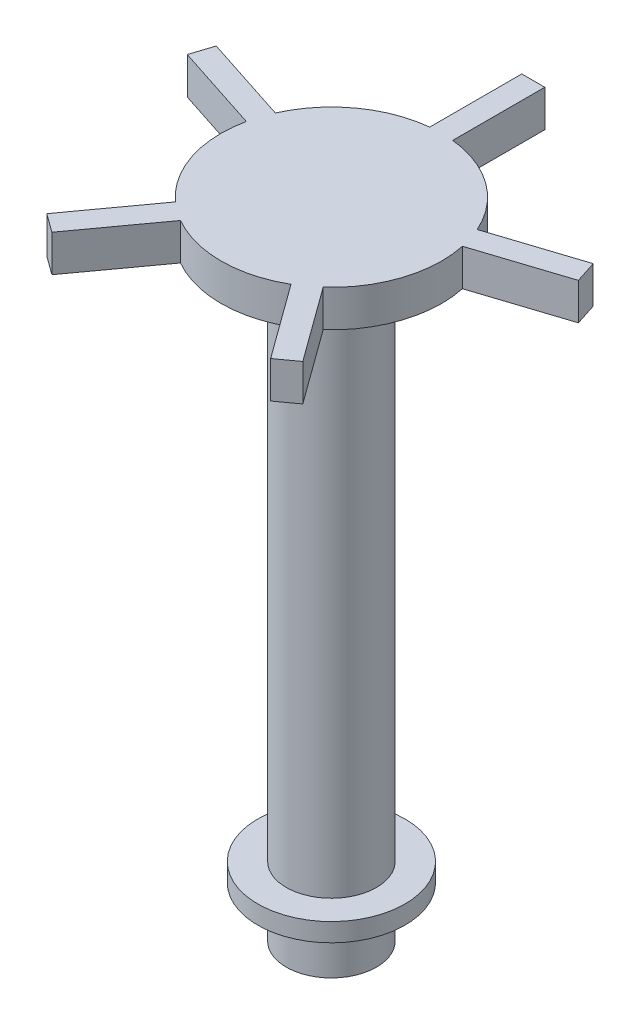
ISO-10303-21;
HEADER;
FILE_DESCRIPTION(('STEP AP214'),'2;1');
FILE_NAME('part.step','',(''),(''),'','','');
FILE_SCHEMA(('AUTOMOTIVE_DESIGN { 1 0 10303 214 1 1 1 1 }'));
ENDSEC;
DATA;
#1=APPLICATION_CONTEXT('core data for automotive mechanical design processes');
#2=APPLICATION_PROTOCOL_DEFINITION('international standard','automotive_design',2000,#1);
#3=PRODUCT_CONTEXT('',#1,'mechanical');
#4=PRODUCT('Part','Part','',(#3));
#5=PRODUCT_RELATED_PRODUCT_CATEGORY('part','',(#4));
#6=PRODUCT_DEFINITION_FORMATION('','',#4);
#7=PRODUCT_DEFINITION_CONTEXT('part definition',#1,'design');
#8=PRODUCT_DEFINITION('design','',#6,#7);
#9=PRODUCT_DEFINITION_SHAPE('','',#8);
#10=(LENGTH_UNIT() NAMED_UNIT(*) SI_UNIT(.MILLI.,.METRE.));
#11=(NAMED_UNIT(*) PLANE_ANGLE_UNIT() SI_UNIT($,.RADIAN.));
#12=(NAMED_UNIT(*) SI_UNIT($,.STERADIAN.) SOLID_ANGLE_UNIT());
#13=UNCERTAINTY_MEASURE_WITH_UNIT(LENGTH_MEASURE(1.E-05),#10,'distance_accuracy_value','');
#14=(GEOMETRIC_REPRESENTATION_CONTEXT(3) GLOBAL_UNCERTAINTY_ASSIGNED_CONTEXT((#13)) GLOBAL_UNIT_ASSIGNED_CONTEXT((#10,
#11,#12)) REPRESENTATION_CONTEXT('',''));
#15=CARTESIAN_POINT('',(0.,0.,0.));
#16=DIRECTION('',(0.,0.,1.));
#17=DIRECTION('',(1.,0.,0.));
#18=AXIS2_PLACEMENT_3D('',#15,#16,#17);
#19=CARTESIAN_POINT('',(0.,-35.,0.));
#20=DIRECTION('',(0.,-1.,0.));
#21=DIRECTION('',(0.,0.,-1.));
#22=AXIS2_PLACEMENT_3D('',#19,#20,#21);
#23=CYLINDRICAL_SURFACE('',#22,12.);
#24=CARTESIAN_POINT('',(0.,35.,0.));
#25=DIRECTION('',(0.,-1.,0.));
#26=DIRECTION('',(0.,0.,-1.));
#27=AXIS2_PLACEMENT_3D('',#24,#25,#26);
#28=CIRCLE('',#27,12.);
#29=CARTESIAN_POINT('',(-8.02632262780261,35.,8.92065833189591));
#30=VERTEX_POINT('',#29);
#31=CARTESIAN_POINT('',(-11.7368628164568,35.,-2.49921012075276));
#32=VERTEX_POINT('',#31);
#33=EDGE_CURVE('E201',#30,#32,#28,.T.);
#34=ORIENTED_EDGE('',*,*,#33,.T.);
#35=DIRECTION('',(0.,1.,0.));
#36=VECTOR('',#35,1.);
#37=CARTESIAN_POINT('',(-11.7368628164568,19.3535729678745,-2.49921012075276));
#38=LINE('',#37,#36);
#39=CARTESIAN_POINT('',(-11.7368628164568,31.,-2.49921012075276));
#40=VERTEX_POINT('',#39);
#41=EDGE_CURVE('E335',#40,#32,#38,.T.);
#42=ORIENTED_EDGE('',*,*,#41,.F.);
#43=CARTESIAN_POINT('',(0.,31.,0.));
#44=DIRECTION('',(0.,-1.,0.));
#45=DIRECTION('',(0.,0.,-1.));
#46=AXIS2_PLACEMENT_3D('',#43,#44,#45);
#47=CIRCLE('',#46,12.);
#48=CARTESIAN_POINT('',(-8.02632262780261,31.,8.92065833189591));
#49=VERTEX_POINT('',#48);
#50=EDGE_CURVE('E213',#49,#40,#47,.T.);
#51=ORIENTED_EDGE('',*,*,#50,.F.);
#52=DIRECTION('',(0.,1.,0.));
#53=VECTOR('',#52,1.);
#54=CARTESIAN_POINT('',(-8.02632262780261,18.598273272856,8.92065833189591));
#55=LINE('',#54,#53);
#56=EDGE_CURVE('E64',#49,#30,#55,.T.);
#57=ORIENTED_EDGE('',*,*,#56,.T.);
#58=EDGE_LOOP('',(#34,#42,#51,#57));
#59=FACE_BOUND('',#58,.T.);
#60=ADVANCED_FACE('F40',(#59),#23,.T.);
#61=CARTESIAN_POINT('',(6.00378014186511,35.,10.3901214626272));
#62=VERTEX_POINT('',#61);
#63=CARTESIAN_POINT('',(-6.00378014186525,35.,10.3901214626271));
#64=VERTEX_POINT('',#63);
#65=EDGE_CURVE('E204',#62,#64,#28,.T.);
#66=ORIENTED_EDGE('',*,*,#65,.T.);
#67=DIRECTION('',(0.,1.,0.));
#68=VECTOR('',#67,1.);
#69=CARTESIAN_POINT('',(-6.00378014186525,18.598273272856,10.3901214626271));
#70=LINE('',#69,#68);
#71=CARTESIAN_POINT('',(-6.00378014186525,31.,10.3901214626271));
#72=VERTEX_POINT('',#71);
#73=EDGE_CURVE('E316',#72,#64,#70,.T.);
#74=ORIENTED_EDGE('',*,*,#73,.F.);
#75=CARTESIAN_POINT('',(6.0037801418651,31.,10.3901214626272));
#76=VERTEX_POINT('',#75);
#77=EDGE_CURVE('E211',#76,#72,#47,.T.);
#78=ORIENTED_EDGE('',*,*,#77,.F.);
#79=DIRECTION('',(0.,1.,0.));
#80=VECTOR('',#79,1.);
#81=CARTESIAN_POINT('',(6.00378014186511,18.598273272856,10.3901214626272));
#82=LINE('',#81,#80);
#83=EDGE_CURVE('E286',#76,#62,#82,.T.);
#84=ORIENTED_EDGE('',*,*,#83,.T.);
#85=EDGE_LOOP('',(#66,#74,#78,#84));
#86=FACE_BOUND('',#85,.T.);
#87=ADVANCED_FACE('F370',(#86),#23,.T.);
#88=CARTESIAN_POINT('',(11.7368628164569,35.,-2.49921012075259));
#89=VERTEX_POINT('',#88);
#90=CARTESIAN_POINT('',(8.02632262780248,35.,8.92065833189603));
#91=VERTEX_POINT('',#90);
#92=EDGE_CURVE('E48',#89,#91,#28,.T.);
#93=ORIENTED_EDGE('',*,*,#92,.T.);
#94=DIRECTION('',(0.,1.,0.));
#95=VECTOR('',#94,1.);
#96=CARTESIAN_POINT('',(8.02632262780248,18.598273272856,8.92065833189603));
#97=LINE('',#96,#95);
#98=CARTESIAN_POINT('',(8.02632262780248,31.,8.92065833189603));
#99=VERTEX_POINT('',#98);
#100=EDGE_CURVE('E294',#99,#91,#97,.T.);
#101=ORIENTED_EDGE('',*,*,#100,.F.);
#102=CARTESIAN_POINT('',(11.7368628164569,31.,-2.49921012075259));
#103=VERTEX_POINT('',#102);
#104=EDGE_CURVE('E206',#103,#99,#47,.T.);
#105=ORIENTED_EDGE('',*,*,#104,.F.);
#106=DIRECTION('',(0.,1.,0.));
#107=VECTOR('',#106,1.);
#108=CARTESIAN_POINT('',(11.7368628164569,19.3535729678745,-2.49921012075259));
#109=LINE('',#108,#107);
#110=EDGE_CURVE('E261',#103,#89,#109,.T.);
#111=ORIENTED_EDGE('',*,*,#110,.T.);
#112=EDGE_LOOP('',(#93,#101,#105,#111));
#113=FACE_BOUND('',#112,.T.);
#114=ADVANCED_FACE('F381',(#113),#23,.T.);
#115=CARTESIAN_POINT('',(1.25,35.,-11.93471826228));
#116=VERTEX_POINT('',#115);
#117=CARTESIAN_POINT('',(10.9643203305195,35.,-4.87685141149048));
#118=VERTEX_POINT('',#117);
#119=EDGE_CURVE('E11',#116,#118,#28,.T.);
#120=ORIENTED_EDGE('',*,*,#119,.T.);
#121=DIRECTION('',(0.,1.,0.));
#122=VECTOR('',#121,1.);
#123=CARTESIAN_POINT('',(10.9643203305195,19.3535729678745,-4.87685141149048));
#124=LINE('',#123,#122);
#125=CARTESIAN_POINT('',(10.9643203305195,31.,-4.87685141149048));
#126=VERTEX_POINT('',#125);
#127=EDGE_CURVE('E269',#126,#118,#124,.T.);
#128=ORIENTED_EDGE('',*,*,#127,.F.);
#129=CARTESIAN_POINT('',(1.25,31.,-11.93471826228));
#130=VERTEX_POINT('',#129);
#131=EDGE_CURVE('E202',#130,#126,#47,.T.);
#132=ORIENTED_EDGE('',*,*,#131,.F.);
#133=DIRECTION('',(0.,1.,0.));
#134=VECTOR('',#133,1.);
#135=CARTESIAN_POINT('',(1.25,20.6922359359558,-11.93471826228));
#136=LINE('',#135,#134);
#137=EDGE_CURVE('E239',#130,#116,#136,.T.);
#138=ORIENTED_EDGE('',*,*,#137,.T.);
#139=EDGE_LOOP('',(#120,#128,#132,#138));
#140=FACE_BOUND('',#139,.T.);
#141=ADVANCED_FACE('F404',(#140),#23,.T.);
#142=CARTESIAN_POINT('',(0.,35.,0.));
#143=DIRECTION('',(0.,-1.,0.));
#144=DIRECTION('',(0.,0.,-1.));
#145=AXIS2_PLACEMENT_3D('',#142,#143,#144);
#146=PLANE('',#145);
#147=ORIENTED_EDGE('',*,*,#119,.F.);
#148=DIRECTION('',(0.,0.,-1.));
#149=VECTOR('',#148,1.);
#150=CARTESIAN_POINT('',(1.25,35.,-11.93471826228));
#151=LINE('',#150,#149);
#152=CARTESIAN_POINT('',(1.25,35.,-21.93471826228));
#153=VERTEX_POINT('',#152);
#154=EDGE_CURVE('E252',#116,#153,#151,.T.);
#155=ORIENTED_EDGE('',*,*,#154,.T.);
#156=DIRECTION('',(-1.,0.,0.));
#157=VECTOR('',#156,1.);
#158=CARTESIAN_POINT('',(-1.25,35.,-21.93471826228));
#159=LINE('',#158,#157);
#160=CARTESIAN_POINT('',(-1.25,35.,-21.93471826228));
#161=VERTEX_POINT('',#160);
#162=EDGE_CURVE('E250',#153,#161,#159,.T.);
#163=ORIENTED_EDGE('',*,*,#162,.T.);
#164=DIRECTION('',(0.,0.,1.));
#165=VECTOR('',#164,1.);
#166=CARTESIAN_POINT('',(-1.25,35.,-11.93471826228));
#167=LINE('',#166,#165);
#168=CARTESIAN_POINT('',(-1.25,35.,-11.93471826228));
#169=VERTEX_POINT('',#168);
#170=EDGE_CURVE('E200',#161,#169,#167,.T.);
#171=ORIENTED_EDGE('',*,*,#170,.T.);
#172=CARTESIAN_POINT('',(-10.9643203305194,35.,-4.87685141149063));
#173=VERTEX_POINT('',#172);
#174=EDGE_CURVE('E49',#173,#169,#28,.T.);
#175=ORIENTED_EDGE('',*,*,#174,.F.);
#176=DIRECTION('',(-0.95105651629515,0.,-0.309016994374958));
#177=VECTOR('',#176,1.);
#178=CARTESIAN_POINT('',(-10.9643203305194,35.,-4.87685141149063));
#179=LINE('',#178,#177);
#180=CARTESIAN_POINT('',(-20.4748854934709,35.,-7.96702135524021));
#181=VERTEX_POINT('',#180);
#182=EDGE_CURVE('E178',#173,#181,#179,.T.);
#183=ORIENTED_EDGE('',*,*,#182,.T.);
#184=DIRECTION('',(-0.309016994374958,0.,0.95105651629515));
#185=VECTOR('',#184,1.);
#186=CARTESIAN_POINT('',(-21.2474279794083,35.,-5.58938006450234));
#187=LINE('',#186,#185);
#188=CARTESIAN_POINT('',(-21.2474279794083,35.,-5.58938006450234));
#189=VERTEX_POINT('',#188);
#190=EDGE_CURVE('E186',#181,#189,#187,.T.);
#191=ORIENTED_EDGE('',*,*,#190,.T.);
#192=DIRECTION('',(0.95105651629515,0.,0.309016994374958));
#193=VECTOR('',#192,1.);
#194=CARTESIAN_POINT('',(-11.7368628164568,35.,-2.49921012075276));
#195=LINE('',#194,#193);
#196=EDGE_CURVE('E194',#189,#32,#195,.T.);
#197=ORIENTED_EDGE('',*,*,#196,.T.);
#198=ORIENTED_EDGE('',*,*,#33,.F.);
#199=DIRECTION('',(-0.58778525229248,0.,0.809016994374942));
#200=VECTOR('',#199,1.);
#201=CARTESIAN_POINT('',(-8.02632262780261,35.,8.92065833189591));
#202=LINE('',#201,#200);
#203=CARTESIAN_POINT('',(-13.9041751507274,35.,17.0108282756453));
#204=VERTEX_POINT('',#203);
#205=EDGE_CURVE('E324',#30,#204,#202,.T.);
#206=ORIENTED_EDGE('',*,*,#205,.T.);
#207=DIRECTION('',(0.809016994374942,0.,0.58778525229248));
#208=VECTOR('',#207,1.);
#209=CARTESIAN_POINT('',(-11.8816326647901,35.,18.4802914063765));
#210=LINE('',#209,#208);
#211=CARTESIAN_POINT('',(-11.8816326647901,35.,18.4802914063765));
#212=VERTEX_POINT('',#211);
#213=EDGE_CURVE('E321',#204,#212,#210,.T.);
#214=ORIENTED_EDGE('',*,*,#213,.T.);
#215=DIRECTION('',(0.58778525229248,0.,-0.809016994374942));
#216=VECTOR('',#215,1.);
#217=CARTESIAN_POINT('',(-6.00378014186525,35.,10.3901214626271));
#218=LINE('',#217,#216);
#219=EDGE_CURVE('E312',#212,#64,#218,.T.);
#220=ORIENTED_EDGE('',*,*,#219,.T.);
#221=ORIENTED_EDGE('',*,*,#65,.F.);
#222=DIRECTION('',(0.587785252292469,0.,0.809016994374951));
#223=VECTOR('',#222,1.);
#224=CARTESIAN_POINT('',(6.00378014186511,35.,10.3901214626272));
#225=LINE('',#224,#223);
#226=CARTESIAN_POINT('',(11.8816326647898,35.,18.4802914063767));
#227=VERTEX_POINT('',#226);
#228=EDGE_CURVE('E302',#62,#227,#225,.T.);
#229=ORIENTED_EDGE('',*,*,#228,.T.);
#230=DIRECTION('',(0.809016994374951,0.,-0.587785252292469));
#231=VECTOR('',#230,1.);
#232=CARTESIAN_POINT('',(13.9041751507272,35.,17.0108282756455));
#233=LINE('',#232,#231);
#234=CARTESIAN_POINT('',(13.9041751507272,35.,17.0108282756455));
#235=VERTEX_POINT('',#234);
#236=EDGE_CURVE('E299',#227,#235,#233,.T.);
#237=ORIENTED_EDGE('',*,*,#236,.T.);
#238=DIRECTION('',(-0.587785252292469,0.,-0.809016994374951));
#239=VECTOR('',#238,1.);
#240=CARTESIAN_POINT('',(8.02632262780248,35.,8.92065833189603));
#241=LINE('',#240,#239);
#242=EDGE_CURVE('E290',#235,#91,#241,.T.);
#243=ORIENTED_EDGE('',*,*,#242,.T.);
#244=ORIENTED_EDGE('',*,*,#92,.F.);
#245=DIRECTION('',(0.951056516295155,0.,-0.309016994374945));
#246=VECTOR('',#245,1.);
#247=CARTESIAN_POINT('',(11.7368628164569,35.,-2.49921012075259));
#248=LINE('',#247,#246);
#249=CARTESIAN_POINT('',(21.2474279794084,35.,-5.58938006450204));
#250=VERTEX_POINT('',#249);
#251=EDGE_CURVE('E277',#89,#250,#248,.T.);
#252=ORIENTED_EDGE('',*,*,#251,.T.);
#253=DIRECTION('',(-0.309016994374945,0.,-0.951056516295155));
#254=VECTOR('',#253,1.);
#255=CARTESIAN_POINT('',(20.4748854934711,35.,-7.96702135523993));
#256=LINE('',#255,#254);
#257=CARTESIAN_POINT('',(20.4748854934711,35.,-7.96702135523993));
#258=VERTEX_POINT('',#257);
#259=EDGE_CURVE('E274',#250,#258,#256,.T.);
#260=ORIENTED_EDGE('',*,*,#259,.T.);
#261=DIRECTION('',(-0.951056516295155,0.,0.309016994374945));
#262=VECTOR('',#261,1.);
#263=CARTESIAN_POINT('',(10.9643203305195,35.,-4.87685141149048));
#264=LINE('',#263,#262);
#265=EDGE_CURVE('E265',#258,#118,#264,.T.);
#266=ORIENTED_EDGE('',*,*,#265,.T.);
#267=EDGE_LOOP('',(#147,#155,#163,#171,#175,#183,#191,#197,#198,#206,#214,#220,#221,#229,#237,
#243,#244,#252,#260,#266));
#268=FACE_BOUND('',#267,.T.);
#269=ADVANCED_FACE('F42',(#268),#146,.F.);
#270=CARTESIAN_POINT('',(-10.9643203305194,31.,-4.87685141149063));
#271=VERTEX_POINT('',#270);
#272=CARTESIAN_POINT('',(-1.25,31.,-11.93471826228));
#273=VERTEX_POINT('',#272);
#274=EDGE_CURVE('E193',#271,#273,#47,.T.);
#275=ORIENTED_EDGE('',*,*,#274,.F.);
#276=DIRECTION('',(0.,1.,0.));
#277=VECTOR('',#276,1.);
#278=CARTESIAN_POINT('',(-10.9643203305194,19.3535729678745,-4.87685141149063));
#279=LINE('',#278,#277);
#280=EDGE_CURVE('E56',#271,#173,#279,.T.);
#281=ORIENTED_EDGE('',*,*,#280,.T.);
#282=ORIENTED_EDGE('',*,*,#174,.T.);
#283=DIRECTION('',(0.,1.,0.));
#284=VECTOR('',#283,1.);
#285=CARTESIAN_POINT('',(-1.25,20.6922359359558,-11.93471826228));
#286=LINE('',#285,#284);
#287=EDGE_CURVE('E246',#273,#169,#286,.T.);
#288=ORIENTED_EDGE('',*,*,#287,.F.);
#289=EDGE_LOOP('',(#275,#281,#282,#288));
#290=FACE_BOUND('',#289,.T.);
#291=ADVANCED_FACE('F190',(#290),#23,.T.);
#292=CARTESIAN_POINT('',(0.,31.,0.));
#293=DIRECTION('',(0.,1.,0.));
#294=DIRECTION('',(0.,0.,1.));
#295=AXIS2_PLACEMENT_3D('',#292,#293,#294);
#296=PLANE('',#295);
#297=CARTESIAN_POINT('',(0.,31.,0.));
#298=DIRECTION('',(0.,-1.,0.));
#299=DIRECTION('',(0.,0.,-1.));
#300=AXIS2_PLACEMENT_3D('',#297,#298,#299);
#301=CIRCLE('',#300,4.90000000000001);
#302=CARTESIAN_POINT('',(0.,31.,-4.90000000000001));
#303=VERTEX_POINT('',#302);
#304=EDGE_CURVE('E214',#303,#303,#301,.T.);
#305=ORIENTED_EDGE('',*,*,#304,.F.);
#306=EDGE_LOOP('',(#305));
#307=FACE_BOUND('',#306,.T.);
#308=ORIENTED_EDGE('',*,*,#131,.T.);
#309=DIRECTION('',(0.951056516295155,0.,-0.309016994374945));
#310=VECTOR('',#309,1.);
#311=CARTESIAN_POINT('',(10.9643203305195,31.,-4.87685141149048));
#312=LINE('',#311,#310);
#313=CARTESIAN_POINT('',(20.4748854934711,31.,-7.96702135523993));
#314=VERTEX_POINT('',#313);
#315=EDGE_CURVE('E260',#126,#314,#312,.T.);
#316=ORIENTED_EDGE('',*,*,#315,.T.);
#317=DIRECTION('',(0.309016994374945,0.,0.951056516295155));
#318=VECTOR('',#317,1.);
#319=CARTESIAN_POINT('',(20.4748854934711,31.,-7.96702135523993));
#320=LINE('',#319,#318);
#321=CARTESIAN_POINT('',(21.2474279794084,31.,-5.58938006450204));
#322=VERTEX_POINT('',#321);
#323=EDGE_CURVE('E271',#314,#322,#320,.T.);
#324=ORIENTED_EDGE('',*,*,#323,.T.);
#325=DIRECTION('',(-0.951056516295155,0.,0.309016994374945));
#326=VECTOR('',#325,1.);
#327=CARTESIAN_POINT('',(11.7368628164569,31.,-2.49921012075259));
#328=LINE('',#327,#326);
#329=EDGE_CURVE('E255',#322,#103,#328,.T.);
#330=ORIENTED_EDGE('',*,*,#329,.T.);
#331=ORIENTED_EDGE('',*,*,#104,.T.);
#332=DIRECTION('',(0.587785252292469,0.,0.809016994374951));
#333=VECTOR('',#332,1.);
#334=CARTESIAN_POINT('',(8.02632262780248,31.,8.92065833189603));
#335=LINE('',#334,#333);
#336=CARTESIAN_POINT('',(13.9041751507272,31.,17.0108282756455));
#337=VERTEX_POINT('',#336);
#338=EDGE_CURVE('E285',#99,#337,#335,.T.);
#339=ORIENTED_EDGE('',*,*,#338,.T.);
#340=DIRECTION('',(-0.809016994374951,0.,0.587785252292469));
#341=VECTOR('',#340,1.);
#342=CARTESIAN_POINT('',(13.9041751507272,31.,17.0108282756455));
#343=LINE('',#342,#341);
#344=CARTESIAN_POINT('',(11.8816326647898,31.,18.4802914063767));
#345=VERTEX_POINT('',#344);
#346=EDGE_CURVE('E296',#337,#345,#343,.T.);
#347=ORIENTED_EDGE('',*,*,#346,.T.);
#348=DIRECTION('',(-0.587785252292469,0.,-0.809016994374951));
#349=VECTOR('',#348,1.);
#350=CARTESIAN_POINT('',(6.00378014186511,31.,10.3901214626272));
#351=LINE('',#350,#349);
#352=EDGE_CURVE('E280',#345,#76,#351,.T.);
#353=ORIENTED_EDGE('',*,*,#352,.T.);
#354=ORIENTED_EDGE('',*,*,#77,.T.);
#355=DIRECTION('',(-0.58778525229248,0.,0.809016994374942));
#356=VECTOR('',#355,1.);
#357=CARTESIAN_POINT('',(-6.00378014186525,31.,10.3901214626271));
#358=LINE('',#357,#356);
#359=CARTESIAN_POINT('',(-11.8816326647901,31.,18.4802914063765));
#360=VERTEX_POINT('',#359);
#361=EDGE_CURVE('E309',#72,#360,#358,.T.);
#362=ORIENTED_EDGE('',*,*,#361,.T.);
#363=DIRECTION('',(-0.809016994374942,0.,-0.58778525229248));
#364=VECTOR('',#363,1.);
#365=CARTESIAN_POINT('',(-11.8816326647901,31.,18.4802914063765));
#366=LINE('',#365,#364);
#367=CARTESIAN_POINT('',(-13.9041751507274,31.,17.0108282756453));
#368=VERTEX_POINT('',#367);
#369=EDGE_CURVE('E318',#360,#368,#366,.T.);
#370=ORIENTED_EDGE('',*,*,#369,.T.);
#371=DIRECTION('',(0.58778525229248,0.,-0.809016994374942));
#372=VECTOR('',#371,1.);
#373=CARTESIAN_POINT('',(-8.02632262780261,31.,8.92065833189591));
#374=LINE('',#373,#372);
#375=EDGE_CURVE('E305',#368,#49,#374,.T.);
#376=ORIENTED_EDGE('',*,*,#375,.T.);
#377=ORIENTED_EDGE('',*,*,#50,.T.);
#378=DIRECTION('',(-0.95105651629515,0.,-0.309016994374958));
#379=VECTOR('',#378,1.);
#380=CARTESIAN_POINT('',(-11.7368628164568,31.,-2.49921012075276));
#381=LINE('',#380,#379);
#382=CARTESIAN_POINT('',(-21.2474279794083,31.,-5.58938006450234));
#383=VERTEX_POINT('',#382);
#384=EDGE_CURVE('E330',#40,#383,#381,.T.);
#385=ORIENTED_EDGE('',*,*,#384,.T.);
#386=DIRECTION('',(0.309016994374958,0.,-0.95105651629515));
#387=VECTOR('',#386,1.);
#388=CARTESIAN_POINT('',(-21.2474279794083,31.,-5.58938006450234));
#389=LINE('',#388,#387);
#390=CARTESIAN_POINT('',(-20.4748854934709,31.,-7.96702135524021));
#391=VERTEX_POINT('',#390);
#392=EDGE_CURVE('E337',#383,#391,#389,.T.);
#393=ORIENTED_EDGE('',*,*,#392,.T.);
#394=DIRECTION('',(0.95105651629515,0.,0.309016994374958));
#395=VECTOR('',#394,1.);
#396=CARTESIAN_POINT('',(-10.9643203305194,31.,-4.87685141149063));
#397=LINE('',#396,#395);
#398=EDGE_CURVE('E327',#391,#271,#397,.T.);
#399=ORIENTED_EDGE('',*,*,#398,.T.);
#400=ORIENTED_EDGE('',*,*,#274,.T.);
#401=DIRECTION('',(0.,0.,-1.));
#402=VECTOR('',#401,1.);
#403=CARTESIAN_POINT('',(-1.25,31.,-11.93471826228));
#404=LINE('',#403,#402);
#405=CARTESIAN_POINT('',(-1.25,31.,-21.93471826228));
#406=VERTEX_POINT('',#405);
#407=EDGE_CURVE('E238',#273,#406,#404,.T.);
#408=ORIENTED_EDGE('',*,*,#407,.T.);
#409=DIRECTION('',(1.,0.,0.));
#410=VECTOR('',#409,1.);
#411=CARTESIAN_POINT('',(-1.25,31.,-21.93471826228));
#412=LINE('',#411,#410);
#413=CARTESIAN_POINT('',(1.25,31.,-21.93471826228));
#414=VERTEX_POINT('',#413);
#415=EDGE_CURVE('E248',#406,#414,#412,.T.);
#416=ORIENTED_EDGE('',*,*,#415,.T.);
#417=DIRECTION('',(0.,0.,1.));
#418=VECTOR('',#417,1.);
#419=CARTESIAN_POINT('',(1.25,31.,-11.93471826228));
#420=LINE('',#419,#418);
#421=EDGE_CURVE('E236',#414,#130,#420,.T.);
#422=ORIENTED_EDGE('',*,*,#421,.T.);
#423=EDGE_LOOP('',(#308,#316,#324,#330,#331,#339,#347,#353,#354,#362,#370,#376,#377,#385,#393,
#399,#400,#408,#416,#422));
#424=FACE_BOUND('',#423,.T.);
#425=ADVANCED_FACE('F343',(#307,#424),#296,.F.);
#426=CARTESIAN_POINT('',(0.,-35.,0.));
#427=DIRECTION('',(0.,-1.,0.));
#428=DIRECTION('',(0.,0.,-1.));
#429=AXIS2_PLACEMENT_3D('',#426,#427,#428);
#430=CYLINDRICAL_SURFACE('',#429,4.9);
#431=CARTESIAN_POINT('',(0.,-27.5,0.));
#432=DIRECTION('',(0.,-1.,0.));
#433=DIRECTION('',(0.,0.,-1.));
#434=AXIS2_PLACEMENT_3D('',#431,#432,#433);
#435=CIRCLE('',#434,4.9);
#436=CARTESIAN_POINT('',(0.,-27.5,-4.9));
#437=VERTEX_POINT('',#436);
#438=EDGE_CURVE('E218',#437,#437,#435,.T.);
#439=ORIENTED_EDGE('',*,*,#438,.F.);
#440=EDGE_LOOP('',(#439));
#441=FACE_BOUND('',#440,.T.);
#442=ORIENTED_EDGE('',*,*,#304,.T.);
#443=EDGE_LOOP('',(#442));
#444=FACE_BOUND('',#443,.T.);
#445=ADVANCED_FACE('F409',(#441,#444),#430,.T.);
#446=CARTESIAN_POINT('',(0.,-27.5,0.));
#447=DIRECTION('',(0.,1.,0.));
#448=DIRECTION('',(0.,0.,1.));
#449=AXIS2_PLACEMENT_3D('',#446,#447,#448);
#450=PLANE('',#449);
#451=ORIENTED_EDGE('',*,*,#438,.T.);
#452=EDGE_LOOP('',(#451));
#453=FACE_BOUND('',#452,.T.);
#454=CARTESIAN_POINT('',(0.,-27.5,0.));
#455=DIRECTION('',(0.,-1.,0.));
#456=DIRECTION('',(0.,0.,-1.));
#457=AXIS2_PLACEMENT_3D('',#454,#455,#456);
#458=CIRCLE('',#457,8.);
#459=CARTESIAN_POINT('',(0.,-27.5,-8.));
#460=VERTEX_POINT('',#459);
#461=EDGE_CURVE('E222',#460,#460,#458,.T.);
#462=ORIENTED_EDGE('',*,*,#461,.F.);
#463=EDGE_LOOP('',(#462));
#464=FACE_BOUND('',#463,.T.);
#465=ADVANCED_FACE('F463',(#453,#464),#450,.T.);
#466=CARTESIAN_POINT('',(0.,-35.,0.));
#467=DIRECTION('',(0.,-1.,0.));
#468=DIRECTION('',(0.,0.,-1.));
#469=AXIS2_PLACEMENT_3D('',#466,#467,#468);
#470=CYLINDRICAL_SURFACE('',#469,8.);
#471=ORIENTED_EDGE('',*,*,#461,.T.);
#472=EDGE_LOOP('',(#471));
#473=FACE_BOUND('',#472,.T.);
#474=CARTESIAN_POINT('',(0.,-29.5,0.));
#475=DIRECTION('',(0.,-1.,0.));
#476=DIRECTION('',(0.,0.,-1.));
#477=AXIS2_PLACEMENT_3D('',#474,#475,#476);
#478=CIRCLE('',#477,8.);
#479=CARTESIAN_POINT('',(0.,-29.5,-8.));
#480=VERTEX_POINT('',#479);
#481=EDGE_CURVE('E227',#480,#480,#478,.T.);
#482=ORIENTED_EDGE('',*,*,#481,.F.);
#483=EDGE_LOOP('',(#482));
#484=FACE_BOUND('',#483,.T.);
#485=ADVANCED_FACE('F459',(#473,#484),#470,.T.);
#486=CARTESIAN_POINT('',(0.,-29.5,0.));
#487=DIRECTION('',(0.,-1.,0.));
#488=DIRECTION('',(0.,0.,-1.));
#489=AXIS2_PLACEMENT_3D('',#486,#487,#488);
#490=PLANE('',#489);
#491=ORIENTED_EDGE('',*,*,#481,.T.);
#492=EDGE_LOOP('',(#491));
#493=FACE_BOUND('',#492,.T.);
#494=CARTESIAN_POINT('',(0.,-29.5,0.));
#495=DIRECTION('',(0.,-1.,0.));
#496=DIRECTION('',(0.,0.,-1.));
#497=AXIS2_PLACEMENT_3D('',#494,#495,#496);
#498=CIRCLE('',#497,4.9);
#499=CARTESIAN_POINT('',(0.,-29.5,-4.9));
#500=VERTEX_POINT('',#499);
#501=EDGE_CURVE('E230',#500,#500,#498,.T.);
#502=ORIENTED_EDGE('',*,*,#501,.F.);
#503=EDGE_LOOP('',(#502));
#504=FACE_BOUND('',#503,.T.);
#505=ADVANCED_FACE('F455',(#493,#504),#490,.T.);
#506=CARTESIAN_POINT('',(0.,-35.,0.));
#507=DIRECTION('',(0.,-1.,0.));
#508=DIRECTION('',(0.,0.,-1.));
#509=AXIS2_PLACEMENT_3D('',#506,#507,#508);
#510=CIRCLE('',#509,4.9);
#511=CARTESIAN_POINT('',(0.,-35.,-4.9));
#512=VERTEX_POINT('',#511);
#513=EDGE_CURVE('E233',#512,#512,#510,.T.);
#514=ORIENTED_EDGE('',*,*,#513,.F.);
#515=EDGE_LOOP('',(#514));
#516=FACE_BOUND('',#515,.T.);
#517=ORIENTED_EDGE('',*,*,#501,.T.);
#518=EDGE_LOOP('',(#517));
#519=FACE_BOUND('',#518,.T.);
#520=ADVANCED_FACE('F451',(#516,#519),#430,.T.);
#521=CARTESIAN_POINT('',(0.,-35.,0.));
#522=DIRECTION('',(0.,1.,0.));
#523=DIRECTION('',(0.,0.,1.));
#524=AXIS2_PLACEMENT_3D('',#521,#522,#523);
#525=PLANE('',#524);
#526=ORIENTED_EDGE('',*,*,#513,.T.);
#527=EDGE_LOOP('',(#526));
#528=FACE_BOUND('',#527,.T.);
#529=ADVANCED_FACE('F440',(#528),#525,.F.);
#530=CARTESIAN_POINT('',(-1.25,20.6922359359558,-11.93471826228));
#531=DIRECTION('',(-1.,0.,0.));
#532=DIRECTION('',(0.,0.,1.));
#533=AXIS2_PLACEMENT_3D('',#530,#531,#532);
#534=PLANE('',#533);
#535=ORIENTED_EDGE('',*,*,#407,.F.);
#536=ORIENTED_EDGE('',*,*,#287,.T.);
#537=ORIENTED_EDGE('',*,*,#170,.F.);
#538=DIRECTION('',(0.,1.,0.));
#539=VECTOR('',#538,1.);
#540=CARTESIAN_POINT('',(-1.25,20.6922359359558,-21.93471826228));
#541=LINE('',#540,#539);
#542=EDGE_CURVE('E244',#406,#161,#541,.T.);
#543=ORIENTED_EDGE('',*,*,#542,.F.);
#544=EDGE_LOOP('',(#535,#536,#537,#543));
#545=FACE_BOUND('',#544,.T.);
#546=ADVANCED_FACE('F436',(#545),#534,.T.);
#547=CARTESIAN_POINT('',(-1.25,20.6922359359558,-21.93471826228));
#548=DIRECTION('',(0.,0.,-1.));
#549=DIRECTION('',(-1.,0.,0.));
#550=AXIS2_PLACEMENT_3D('',#547,#548,#549);
#551=PLANE('',#550);
#552=ORIENTED_EDGE('',*,*,#415,.F.);
#553=ORIENTED_EDGE('',*,*,#542,.T.);
#554=ORIENTED_EDGE('',*,*,#162,.F.);
#555=DIRECTION('',(0.,1.,0.));
#556=VECTOR('',#555,1.);
#557=CARTESIAN_POINT('',(1.25,20.6922359359558,-21.93471826228));
#558=LINE('',#557,#556);
#559=EDGE_CURVE('E242',#414,#153,#558,.T.);
#560=ORIENTED_EDGE('',*,*,#559,.F.);
#561=EDGE_LOOP('',(#552,#553,#554,#560));
#562=FACE_BOUND('',#561,.T.);
#563=ADVANCED_FACE('F439',(#562),#551,.T.);
#564=CARTESIAN_POINT('',(1.25,20.6922359359558,-11.93471826228));
#565=DIRECTION('',(1.,0.,0.));
#566=DIRECTION('',(0.,0.,-1.));
#567=AXIS2_PLACEMENT_3D('',#564,#565,#566);
#568=PLANE('',#567);
#569=ORIENTED_EDGE('',*,*,#421,.F.);
#570=ORIENTED_EDGE('',*,*,#559,.T.);
#571=ORIENTED_EDGE('',*,*,#154,.F.);
#572=ORIENTED_EDGE('',*,*,#137,.F.);
#573=EDGE_LOOP('',(#569,#570,#571,#572));
#574=FACE_BOUND('',#573,.T.);
#575=ADVANCED_FACE('F444',(#574),#568,.T.);
#576=CARTESIAN_POINT('',(10.9643203305195,19.3535729678745,-4.87685141149048));
#577=DIRECTION('',(-0.309016994374945,0.,-0.951056516295154));
#578=DIRECTION('',(-0.951056516295155,0.,0.309016994374945));
#579=AXIS2_PLACEMENT_3D('',#576,#577,#578);
#580=PLANE('',#579);
#581=ORIENTED_EDGE('',*,*,#315,.F.);
#582=ORIENTED_EDGE('',*,*,#127,.T.);
#583=ORIENTED_EDGE('',*,*,#265,.F.);
#584=DIRECTION('',(0.,1.,0.));
#585=VECTOR('',#584,1.);
#586=CARTESIAN_POINT('',(20.4748854934711,19.3535729678745,-7.96702135523993));
#587=LINE('',#586,#585);
#588=EDGE_CURVE('E267',#314,#258,#587,.T.);
#589=ORIENTED_EDGE('',*,*,#588,.F.);
#590=EDGE_LOOP('',(#581,#582,#583,#589));
#591=FACE_BOUND('',#590,.T.);
#592=ADVANCED_FACE('F421',(#591),#580,.T.);
#593=CARTESIAN_POINT('',(20.4748854934711,19.3535729678745,-7.96702135523993));
#594=DIRECTION('',(0.951056516295154,0.,-0.309016994374945));
#595=DIRECTION('',(-0.309016994374945,0.,-0.951056516295155));
#596=AXIS2_PLACEMENT_3D('',#593,#594,#595);
#597=PLANE('',#596);
#598=ORIENTED_EDGE('',*,*,#323,.F.);
#599=ORIENTED_EDGE('',*,*,#588,.T.);
#600=ORIENTED_EDGE('',*,*,#259,.F.);
#601=DIRECTION('',(0.,1.,0.));
#602=VECTOR('',#601,1.);
#603=CARTESIAN_POINT('',(21.2474279794084,19.3535729678745,-5.58938006450204));
#604=LINE('',#603,#602);
#605=EDGE_CURVE('E264',#322,#250,#604,.T.);
#606=ORIENTED_EDGE('',*,*,#605,.F.);
#607=EDGE_LOOP('',(#598,#599,#600,#606));
#608=FACE_BOUND('',#607,.T.);
#609=ADVANCED_FACE('F425',(#608),#597,.T.);
#610=CARTESIAN_POINT('',(11.7368628164569,19.3535729678745,-2.49921012075259));
#611=DIRECTION('',(0.309016994374945,0.,0.951056516295154));
#612=DIRECTION('',(0.951056516295155,0.,-0.309016994374945));
#613=AXIS2_PLACEMENT_3D('',#610,#611,#612);
#614=PLANE('',#613);
#615=ORIENTED_EDGE('',*,*,#329,.F.);
#616=ORIENTED_EDGE('',*,*,#605,.T.);
#617=ORIENTED_EDGE('',*,*,#251,.F.);
#618=ORIENTED_EDGE('',*,*,#110,.F.);
#619=EDGE_LOOP('',(#615,#616,#617,#618));
#620=FACE_BOUND('',#619,.T.);
#621=ADVANCED_FACE('F396',(#620),#614,.T.);
#622=CARTESIAN_POINT('',(8.02632262780248,18.598273272856,8.92065833189603));
#623=DIRECTION('',(0.809016994374951,0.,-0.587785252292469));
#624=DIRECTION('',(-0.587785252292469,0.,-0.809016994374951));
#625=AXIS2_PLACEMENT_3D('',#622,#623,#624);
#626=PLANE('',#625);
#627=ORIENTED_EDGE('',*,*,#338,.F.);
#628=ORIENTED_EDGE('',*,*,#100,.T.);
#629=ORIENTED_EDGE('',*,*,#242,.F.);
#630=DIRECTION('',(0.,1.,0.));
#631=VECTOR('',#630,1.);
#632=CARTESIAN_POINT('',(13.9041751507272,18.598273272856,17.0108282756455));
#633=LINE('',#632,#631);
#634=EDGE_CURVE('E292',#337,#235,#633,.T.);
#635=ORIENTED_EDGE('',*,*,#634,.F.);
#636=EDGE_LOOP('',(#627,#628,#629,#635));
#637=FACE_BOUND('',#636,.T.);
#638=ADVANCED_FACE('F386',(#637),#626,.T.);
#639=CARTESIAN_POINT('',(13.9041751507272,18.598273272856,17.0108282756455));
#640=DIRECTION('',(0.587785252292469,0.,0.809016994374951));
#641=DIRECTION('',(0.809016994374951,0.,-0.587785252292469));
#642=AXIS2_PLACEMENT_3D('',#639,#640,#641);
#643=PLANE('',#642);
#644=ORIENTED_EDGE('',*,*,#346,.F.);
#645=ORIENTED_EDGE('',*,*,#634,.T.);
#646=ORIENTED_EDGE('',*,*,#236,.F.);
#647=DIRECTION('',(0.,1.,0.));
#648=VECTOR('',#647,1.);
#649=CARTESIAN_POINT('',(11.8816326647898,18.598273272856,18.4802914063767));
#650=LINE('',#649,#648);
#651=EDGE_CURVE('E289',#345,#227,#650,.T.);
#652=ORIENTED_EDGE('',*,*,#651,.F.);
#653=EDGE_LOOP('',(#644,#645,#646,#652));
#654=FACE_BOUND('',#653,.T.);
#655=ADVANCED_FACE('F388',(#654),#643,.T.);
#656=CARTESIAN_POINT('',(6.00378014186511,18.598273272856,10.3901214626272));
#657=DIRECTION('',(-0.809016994374951,0.,0.587785252292469));
#658=DIRECTION('',(0.587785252292469,0.,0.809016994374951));
#659=AXIS2_PLACEMENT_3D('',#656,#657,#658);
#660=PLANE('',#659);
#661=ORIENTED_EDGE('',*,*,#352,.F.);
#662=ORIENTED_EDGE('',*,*,#651,.T.);
#663=ORIENTED_EDGE('',*,*,#228,.F.);
#664=ORIENTED_EDGE('',*,*,#83,.F.);
#665=EDGE_LOOP('',(#661,#662,#663,#664));
#666=FACE_BOUND('',#665,.T.);
#667=ADVANCED_FACE('F375',(#666),#660,.T.);
#668=CARTESIAN_POINT('',(-6.00378014186525,18.598273272856,10.3901214626271));
#669=DIRECTION('',(0.809016994374942,0.,0.58778525229248));
#670=DIRECTION('',(0.58778525229248,0.,-0.809016994374942));
#671=AXIS2_PLACEMENT_3D('',#668,#669,#670);
#672=PLANE('',#671);
#673=ORIENTED_EDGE('',*,*,#361,.F.);
#674=ORIENTED_EDGE('',*,*,#73,.T.);
#675=ORIENTED_EDGE('',*,*,#219,.F.);
#676=DIRECTION('',(0.,1.,0.));
#677=VECTOR('',#676,1.);
#678=CARTESIAN_POINT('',(-11.8816326647901,18.598273272856,18.4802914063765));
#679=LINE('',#678,#677);
#680=EDGE_CURVE('E314',#360,#212,#679,.T.);
#681=ORIENTED_EDGE('',*,*,#680,.F.);
#682=EDGE_LOOP('',(#673,#674,#675,#681));
#683=FACE_BOUND('',#682,.T.);
#684=ADVANCED_FACE('F365',(#683),#672,.T.);
#685=CARTESIAN_POINT('',(-11.8816326647901,18.598273272856,18.4802914063765));
#686=DIRECTION('',(-0.58778525229248,0.,0.809016994374942));
#687=DIRECTION('',(0.809016994374942,0.,0.58778525229248));
#688=AXIS2_PLACEMENT_3D('',#685,#686,#687);
#689=PLANE('',#688);
#690=ORIENTED_EDGE('',*,*,#369,.F.);
#691=ORIENTED_EDGE('',*,*,#680,.T.);
#692=ORIENTED_EDGE('',*,*,#213,.F.);
#693=DIRECTION('',(0.,1.,0.));
#694=VECTOR('',#693,1.);
#695=CARTESIAN_POINT('',(-13.9041751507274,18.598273272856,17.0108282756453));
#696=LINE('',#695,#694);
#697=EDGE_CURVE('E311',#368,#204,#696,.T.);
#698=ORIENTED_EDGE('',*,*,#697,.F.);
#699=EDGE_LOOP('',(#690,#691,#692,#698));
#700=FACE_BOUND('',#699,.T.);
#701=ADVANCED_FACE('F359',(#700),#689,.T.);
#702=CARTESIAN_POINT('',(-8.02632262780261,18.598273272856,8.92065833189591));
#703=DIRECTION('',(-0.809016994374942,0.,-0.58778525229248));
#704=DIRECTION('',(-0.58778525229248,0.,0.809016994374942));
#705=AXIS2_PLACEMENT_3D('',#702,#703,#704);
#706=PLANE('',#705);
#707=ORIENTED_EDGE('',*,*,#375,.F.);
#708=ORIENTED_EDGE('',*,*,#697,.T.);
#709=ORIENTED_EDGE('',*,*,#205,.F.);
#710=ORIENTED_EDGE('',*,*,#56,.F.);
#711=EDGE_LOOP('',(#707,#708,#709,#710));
#712=FACE_BOUND('',#711,.T.);
#713=ADVANCED_FACE('F356',(#712),#706,.T.);
#714=CARTESIAN_POINT('',(-11.7368628164568,19.3535729678745,-2.49921012075276));
#715=DIRECTION('',(-0.309016994374958,0.,0.95105651629515));
#716=DIRECTION('',(0.95105651629515,0.,0.309016994374958));
#717=AXIS2_PLACEMENT_3D('',#714,#715,#716);
#718=PLANE('',#717);
#719=ORIENTED_EDGE('',*,*,#384,.F.);
#720=ORIENTED_EDGE('',*,*,#41,.T.);
#721=ORIENTED_EDGE('',*,*,#196,.F.);
#722=DIRECTION('',(0.,1.,0.));
#723=VECTOR('',#722,1.);
#724=CARTESIAN_POINT('',(-21.2474279794083,19.3535729678745,-5.58938006450234));
#725=LINE('',#724,#723);
#726=EDGE_CURVE('E333',#383,#189,#725,.T.);
#727=ORIENTED_EDGE('',*,*,#726,.F.);
#728=EDGE_LOOP('',(#719,#720,#721,#727));
#729=FACE_BOUND('',#728,.T.);
#730=ADVANCED_FACE('F350',(#729),#718,.T.);
#731=CARTESIAN_POINT('',(-21.2474279794083,19.3535729678745,-5.58938006450234));
#732=DIRECTION('',(-0.95105651629515,0.,-0.309016994374958));
#733=DIRECTION('',(-0.309016994374958,0.,0.95105651629515));
#734=AXIS2_PLACEMENT_3D('',#731,#732,#733);
#735=PLANE('',#734);
#736=ORIENTED_EDGE('',*,*,#392,.F.);
#737=ORIENTED_EDGE('',*,*,#726,.T.);
#738=ORIENTED_EDGE('',*,*,#190,.F.);
#739=DIRECTION('',(0.,1.,0.));
#740=VECTOR('',#739,1.);
#741=CARTESIAN_POINT('',(-20.4748854934709,19.3535729678745,-7.96702135524021));
#742=LINE('',#741,#740);
#743=EDGE_CURVE('E181',#391,#181,#742,.T.);
#744=ORIENTED_EDGE('',*,*,#743,.F.);
#745=EDGE_LOOP('',(#736,#737,#738,#744));
#746=FACE_BOUND('',#745,.T.);
#747=ADVANCED_FACE('F346',(#746),#735,.T.);
#748=CARTESIAN_POINT('',(-10.9643203305194,19.3535729678745,-4.87685141149063));
#749=DIRECTION('',(0.309016994374958,0.,-0.95105651629515));
#750=DIRECTION('',(-0.95105651629515,0.,-0.309016994374958));
#751=AXIS2_PLACEMENT_3D('',#748,#749,#750);
#752=PLANE('',#751);
#753=ORIENTED_EDGE('',*,*,#398,.F.);
#754=ORIENTED_EDGE('',*,*,#743,.T.);
#755=ORIENTED_EDGE('',*,*,#182,.F.);
#756=ORIENTED_EDGE('',*,*,#280,.F.);
#757=EDGE_LOOP('',(#753,#754,#755,#756));
#758=FACE_BOUND('',#757,.T.);
#759=ADVANCED_FACE('F179',(#758),#752,.T.);
#760=CLOSED_SHELL('',(#60,#87,#114,#141,#269,#291,#425,#445,#465,#485,#505,#520,#529,#546,#563,
#575,#592,#609,#621,#638,#655,#667,#684,#701,#713,#730,#747,#759));
#761=MANIFOLD_SOLID_BREP('B2',#760);
#762=ADVANCED_BREP_SHAPE_REPRESENTATION('',(#18,#761),#14);
#763=SHAPE_DEFINITION_REPRESENTATION(#9,#762);
ENDSEC;
END-ISO-10303-21;
